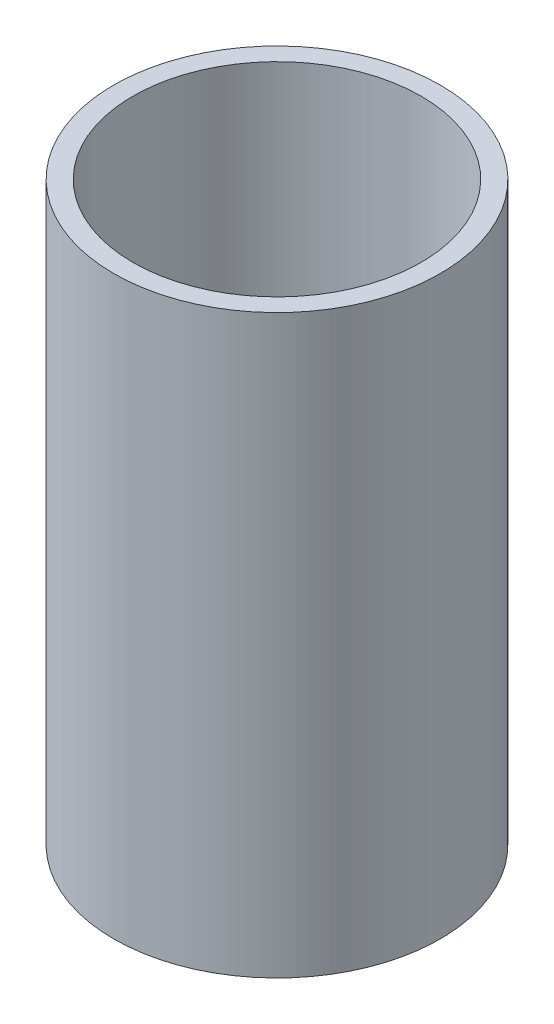
ISO-10303-21;
HEADER;
FILE_DESCRIPTION(('STEP AP214'),'2;1');
FILE_NAME('part.step','',(''),(''),'','','');
FILE_SCHEMA(('AUTOMOTIVE_DESIGN { 1 0 10303 214 1 1 1 1 }'));
ENDSEC;
DATA;
#1=APPLICATION_CONTEXT('core data for automotive mechanical design processes');
#2=APPLICATION_PROTOCOL_DEFINITION('international standard','automotive_design',2000,#1);
#3=PRODUCT_CONTEXT('',#1,'mechanical');
#4=PRODUCT('Part','Part','',(#3));
#5=PRODUCT_RELATED_PRODUCT_CATEGORY('part','',(#4));
#6=PRODUCT_DEFINITION_FORMATION('','',#4);
#7=PRODUCT_DEFINITION_CONTEXT('part definition',#1,'design');
#8=PRODUCT_DEFINITION('design','',#6,#7);
#9=PRODUCT_DEFINITION_SHAPE('','',#8);
#10=(LENGTH_UNIT() NAMED_UNIT(*) SI_UNIT(.MILLI.,.METRE.));
#11=(NAMED_UNIT(*) PLANE_ANGLE_UNIT() SI_UNIT($,.RADIAN.));
#12=(NAMED_UNIT(*) SI_UNIT($,.STERADIAN.) SOLID_ANGLE_UNIT());
#13=UNCERTAINTY_MEASURE_WITH_UNIT(LENGTH_MEASURE(1.E-05),#10,'distance_accuracy_value','');
#14=(GEOMETRIC_REPRESENTATION_CONTEXT(3) GLOBAL_UNCERTAINTY_ASSIGNED_CONTEXT((#13)) GLOBAL_UNIT_ASSIGNED_CONTEXT((#10,
#11,#12)) REPRESENTATION_CONTEXT('',''));
#15=CARTESIAN_POINT('',(0.,0.,0.));
#16=DIRECTION('',(0.,0.,1.));
#17=DIRECTION('',(1.,0.,0.));
#18=AXIS2_PLACEMENT_3D('',#15,#16,#17);
#19=CARTESIAN_POINT('',(0.,60.,0.));
#20=DIRECTION('',(0.,1.,0.));
#21=DIRECTION('',(0.,0.,1.));
#22=AXIS2_PLACEMENT_3D('',#19,#20,#21);
#23=PLANE('',#22);
#24=CARTESIAN_POINT('',(0.,60.,0.));
#25=DIRECTION('',(0.,1.,0.));
#26=DIRECTION('',(0.,0.,1.));
#27=AXIS2_PLACEMENT_3D('',#24,#25,#26);
#28=CIRCLE('',#27,17.);
#29=CARTESIAN_POINT('',(0.,60.,17.));
#30=VERTEX_POINT('',#29);
#31=EDGE_CURVE('E10',#30,#30,#28,.T.);
#32=ORIENTED_EDGE('',*,*,#31,.T.);
#33=EDGE_LOOP('',(#32));
#34=FACE_BOUND('',#33,.T.);
#35=CARTESIAN_POINT('',(0.,60.,0.));
#36=DIRECTION('',(0.,1.,0.));
#37=DIRECTION('',(0.,0.,1.));
#38=AXIS2_PLACEMENT_3D('',#35,#36,#37);
#39=CIRCLE('',#38,15.);
#40=CARTESIAN_POINT('',(0.,60.,15.));
#41=VERTEX_POINT('',#40);
#42=EDGE_CURVE('E52',#41,#41,#39,.T.);
#43=ORIENTED_EDGE('',*,*,#42,.F.);
#44=EDGE_LOOP('',(#43));
#45=FACE_BOUND('',#44,.T.);
#46=ADVANCED_FACE('F39',(#34,#45),#23,.T.);
#47=CARTESIAN_POINT('',(0.,0.,0.));
#48=DIRECTION('',(0.,1.,0.));
#49=DIRECTION('',(0.,0.,1.));
#50=AXIS2_PLACEMENT_3D('',#47,#48,#49);
#51=PLANE('',#50);
#52=CARTESIAN_POINT('',(0.,0.,0.));
#53=DIRECTION('',(0.,1.,0.));
#54=DIRECTION('',(0.,0.,1.));
#55=AXIS2_PLACEMENT_3D('',#52,#53,#54);
#56=CIRCLE('',#55,17.);
#57=CARTESIAN_POINT('',(0.,0.,17.));
#58=VERTEX_POINT('',#57);
#59=EDGE_CURVE('E43',#58,#58,#56,.T.);
#60=ORIENTED_EDGE('',*,*,#59,.F.);
#61=EDGE_LOOP('',(#60));
#62=FACE_BOUND('',#61,.T.);
#63=CARTESIAN_POINT('',(0.,0.,0.));
#64=DIRECTION('',(0.,1.,0.));
#65=DIRECTION('',(0.,0.,1.));
#66=AXIS2_PLACEMENT_3D('',#63,#64,#65);
#67=CIRCLE('',#66,15.);
#68=CARTESIAN_POINT('',(0.,0.,15.));
#69=VERTEX_POINT('',#68);
#70=EDGE_CURVE('E54',#69,#69,#67,.T.);
#71=ORIENTED_EDGE('',*,*,#70,.T.);
#72=EDGE_LOOP('',(#71));
#73=FACE_BOUND('',#72,.T.);
#74=ADVANCED_FACE('F66',(#62,#73),#51,.F.);
#75=CARTESIAN_POINT('',(0.,60.,0.));
#76=DIRECTION('',(0.,-1.,0.));
#77=DIRECTION('',(0.,0.,-1.));
#78=AXIS2_PLACEMENT_3D('',#75,#76,#77);
#79=CYLINDRICAL_SURFACE('',#78,17.);
#80=ORIENTED_EDGE('',*,*,#31,.F.);
#81=EDGE_LOOP('',(#80));
#82=FACE_BOUND('',#81,.T.);
#83=ORIENTED_EDGE('',*,*,#59,.T.);
#84=EDGE_LOOP('',(#83));
#85=FACE_BOUND('',#84,.T.);
#86=ADVANCED_FACE('F41',(#82,#85),#79,.T.);
#87=CARTESIAN_POINT('',(0.,60.,0.));
#88=DIRECTION('',(0.,-1.,0.));
#89=DIRECTION('',(0.,0.,-1.));
#90=AXIS2_PLACEMENT_3D('',#87,#88,#89);
#91=CYLINDRICAL_SURFACE('',#90,15.);
#92=ORIENTED_EDGE('',*,*,#42,.T.);
#93=EDGE_LOOP('',(#92));
#94=FACE_BOUND('',#93,.T.);
#95=ORIENTED_EDGE('',*,*,#70,.F.);
#96=EDGE_LOOP('',(#95));
#97=FACE_BOUND('',#96,.T.);
#98=ADVANCED_FACE('F62',(#94,#97),#91,.F.);
#99=CLOSED_SHELL('',(#46,#74,#86,#98));
#100=MANIFOLD_SOLID_BREP('B2',#99);
#101=ADVANCED_BREP_SHAPE_REPRESENTATION('',(#18,#100),#14);
#102=SHAPE_DEFINITION_REPRESENTATION(#9,#101);
ENDSEC;
END-ISO-10303-21;
